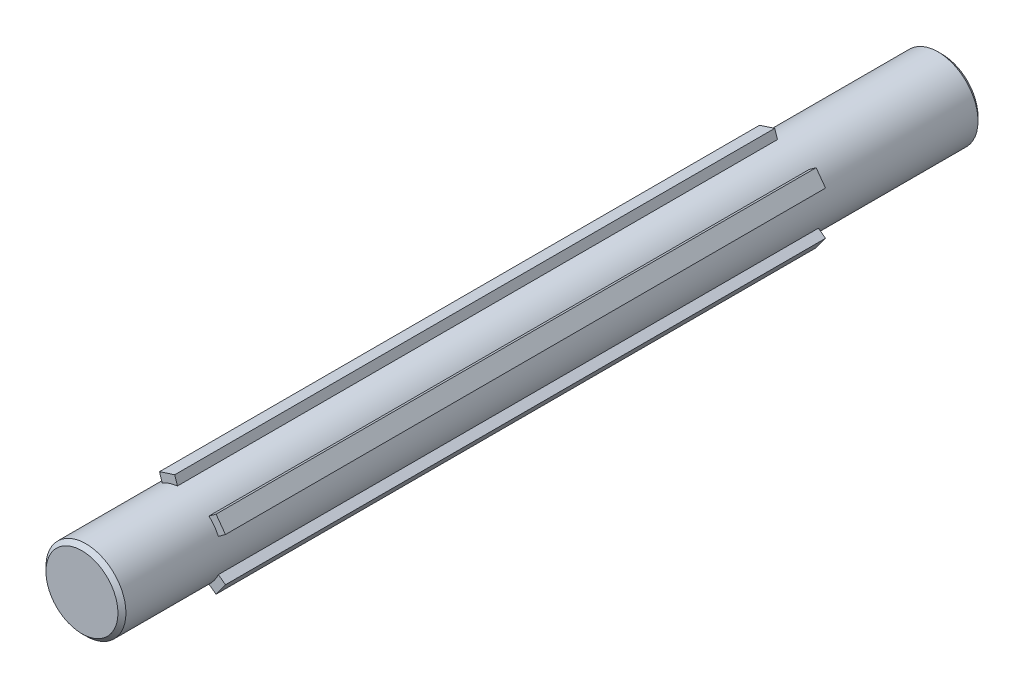
ISO-10303-21;
HEADER;
FILE_DESCRIPTION(('STEP AP214'),'2;1');
FILE_NAME('part.step','',(''),(''),'','','');
FILE_SCHEMA(('AUTOMOTIVE_DESIGN { 1 0 10303 214 1 1 1 1 }'));
ENDSEC;
DATA;
#1=APPLICATION_CONTEXT('core data for automotive mechanical design processes');
#2=APPLICATION_PROTOCOL_DEFINITION('international standard','automotive_design',2000,#1);
#3=PRODUCT_CONTEXT('',#1,'mechanical');
#4=PRODUCT('Part','Part','',(#3));
#5=PRODUCT_RELATED_PRODUCT_CATEGORY('part','',(#4));
#6=PRODUCT_DEFINITION_FORMATION('','',#4);
#7=PRODUCT_DEFINITION_CONTEXT('part definition',#1,'design');
#8=PRODUCT_DEFINITION('design','',#6,#7);
#9=PRODUCT_DEFINITION_SHAPE('','',#8);
#10=(LENGTH_UNIT() NAMED_UNIT(*) SI_UNIT(.MILLI.,.METRE.));
#11=(NAMED_UNIT(*) PLANE_ANGLE_UNIT() SI_UNIT($,.RADIAN.));
#12=(NAMED_UNIT(*) SI_UNIT($,.STERADIAN.) SOLID_ANGLE_UNIT());
#13=UNCERTAINTY_MEASURE_WITH_UNIT(LENGTH_MEASURE(1.E-05),#10,'distance_accuracy_value','');
#14=(GEOMETRIC_REPRESENTATION_CONTEXT(3) GLOBAL_UNCERTAINTY_ASSIGNED_CONTEXT((#13)) GLOBAL_UNIT_ASSIGNED_CONTEXT((#10,
#11,#12)) REPRESENTATION_CONTEXT('',''));
#15=CARTESIAN_POINT('',(0.,0.,0.));
#16=DIRECTION('',(0.,0.,1.));
#17=DIRECTION('',(1.,0.,0.));
#18=AXIS2_PLACEMENT_3D('',#15,#16,#17);
#19=CARTESIAN_POINT('',(0.,0.,215.));
#20=DIRECTION('',(0.,0.,-1.));
#21=DIRECTION('',(-1.,0.,0.));
#22=AXIS2_PLACEMENT_3D('',#19,#20,#21);
#23=CYLINDRICAL_SURFACE('',#22,10.);
#24=CARTESIAN_POINT('',(0.,0.,214.));
#25=DIRECTION('',(0.,0.,1.));
#26=DIRECTION('',(1.,0.,0.));
#27=AXIS2_PLACEMENT_3D('',#24,#25,#26);
#28=CIRCLE('',#27,10.);
#29=CARTESIAN_POINT('',(10.,0.,214.));
#30=VERTEX_POINT('',#29);
#31=EDGE_CURVE('E44',#30,#30,#28,.F.);
#32=ORIENTED_EDGE('',*,*,#31,.T.);
#33=EDGE_LOOP('',(#32));
#34=FACE_BOUND('',#33,.T.);
#35=CARTESIAN_POINT('',(0.,0.,1.));
#36=DIRECTION('',(0.,0.,1.));
#37=DIRECTION('',(1.,0.,0.));
#38=AXIS2_PLACEMENT_3D('',#35,#36,#37);
#39=CIRCLE('',#38,10.);
#40=CARTESIAN_POINT('',(10.,0.,1.));
#41=VERTEX_POINT('',#40);
#42=EDGE_CURVE('E335',#41,#41,#39,.T.);
#43=ORIENTED_EDGE('',*,*,#42,.T.);
#44=EDGE_LOOP('',(#43));
#45=FACE_BOUND('',#44,.T.);
#46=DIRECTION('',(0.,0.,-1.));
#47=VECTOR('',#46,1.);
#48=CARTESIAN_POINT('',(-4.92984886485879,-8.70037873713843,190.));
#49=LINE('',#48,#47);
#50=CARTESIAN_POINT('',(-4.92984886485879,-8.70037873713843,190.));
#51=VERTEX_POINT('',#50);
#52=CARTESIAN_POINT('',(-4.92984886485879,-8.70037873713843,40.));
#53=VERTEX_POINT('',#52);
#54=EDGE_CURVE('E51',#51,#53,#49,.T.);
#55=ORIENTED_EDGE('',*,*,#54,.F.);
#56=CARTESIAN_POINT('',(0.,0.,190.));
#57=DIRECTION('',(0.,0.,1.));
#58=DIRECTION('',(1.,0.,0.));
#59=AXIS2_PLACEMENT_3D('',#56,#57,#58);
#60=CIRCLE('',#59,10.);
#61=CARTESIAN_POINT('',(-1.12562279967817,-9.93644671463822,190.));
#62=VERTEX_POINT('',#61);
#63=EDGE_CURVE('E55',#51,#62,#60,.T.);
#64=ORIENTED_EDGE('',*,*,#63,.T.);
#65=DIRECTION('',(0.,0.,-1.));
#66=VECTOR('',#65,1.);
#67=CARTESIAN_POINT('',(-1.12562279967817,-9.93644671463822,190.));
#68=LINE('',#67,#66);
#69=CARTESIAN_POINT('',(-1.12562279967817,-9.93644671463822,40.));
#70=VERTEX_POINT('',#69);
#71=EDGE_CURVE('E196',#62,#70,#68,.T.);
#72=ORIENTED_EDGE('',*,*,#71,.T.);
#73=CARTESIAN_POINT('',(0.,0.,40.));
#74=DIRECTION('',(0.,0.,1.));
#75=DIRECTION('',(1.,0.,0.));
#76=AXIS2_PLACEMENT_3D('',#73,#74,#75);
#77=CIRCLE('',#76,10.);
#78=EDGE_CURVE('E197',#53,#70,#77,.T.);
#79=ORIENTED_EDGE('',*,*,#78,.F.);
#80=EDGE_LOOP('',(#55,#64,#72,#79));
#81=FACE_BOUND('',#80,.T.);
#82=DIRECTION('',(0.,0.,-1.));
#83=VECTOR('',#82,1.);
#84=CARTESIAN_POINT('',(-9.79795897113271,2.,190.));
#85=LINE('',#84,#83);
#86=CARTESIAN_POINT('',(-9.79795897113271,2.,190.));
#87=VERTEX_POINT('',#86);
#88=CARTESIAN_POINT('',(-9.79795897113271,2.,40.));
#89=VERTEX_POINT('',#88);
#90=EDGE_CURVE('E236',#87,#89,#85,.T.);
#91=ORIENTED_EDGE('',*,*,#90,.F.);
#92=CARTESIAN_POINT('',(0.,0.,190.));
#93=DIRECTION('',(0.,0.,1.));
#94=DIRECTION('',(1.,0.,0.));
#95=AXIS2_PLACEMENT_3D('',#92,#93,#94);
#96=CIRCLE('',#95,10.);
#97=CARTESIAN_POINT('',(-9.79795897113271,-2.,190.));
#98=VERTEX_POINT('',#97);
#99=EDGE_CURVE('E209',#87,#98,#96,.T.);
#100=ORIENTED_EDGE('',*,*,#99,.T.);
#101=DIRECTION('',(0.,0.,-1.));
#102=VECTOR('',#101,1.);
#103=CARTESIAN_POINT('',(-9.79795897113271,-2.,190.));
#104=LINE('',#103,#102);
#105=CARTESIAN_POINT('',(-9.79795897113271,-2.,40.));
#106=VERTEX_POINT('',#105);
#107=EDGE_CURVE('E220',#98,#106,#104,.T.);
#108=ORIENTED_EDGE('',*,*,#107,.T.);
#109=CARTESIAN_POINT('',(0.,0.,40.));
#110=DIRECTION('',(0.,0.,1.));
#111=DIRECTION('',(1.,0.,0.));
#112=AXIS2_PLACEMENT_3D('',#109,#110,#111);
#113=CIRCLE('',#112,10.);
#114=EDGE_CURVE('E208',#89,#106,#113,.T.);
#115=ORIENTED_EDGE('',*,*,#114,.F.);
#116=EDGE_LOOP('',(#91,#100,#108,#115));
#117=FACE_BOUND('',#116,.T.);
#118=DIRECTION('',(0.,0.,-1.));
#119=VECTOR('',#118,1.);
#120=CARTESIAN_POINT('',(-1.12562279967818,9.93644671463822,190.));
#121=LINE('',#120,#119);
#122=CARTESIAN_POINT('',(-1.12562279967818,9.93644671463822,190.));
#123=VERTEX_POINT('',#122);
#124=CARTESIAN_POINT('',(-1.12562279967818,9.93644671463822,40.));
#125=VERTEX_POINT('',#124);
#126=EDGE_CURVE('E267',#123,#125,#121,.T.);
#127=ORIENTED_EDGE('',*,*,#126,.F.);
#128=CARTESIAN_POINT('',(0.,0.,190.));
#129=DIRECTION('',(0.,0.,1.));
#130=DIRECTION('',(1.,0.,0.));
#131=AXIS2_PLACEMENT_3D('',#128,#129,#130);
#132=CIRCLE('',#131,10.);
#133=CARTESIAN_POINT('',(-4.92984886485879,8.70037873713843,190.));
#134=VERTEX_POINT('',#133);
#135=EDGE_CURVE('E240',#123,#134,#132,.T.);
#136=ORIENTED_EDGE('',*,*,#135,.T.);
#137=DIRECTION('',(0.,0.,-1.));
#138=VECTOR('',#137,1.);
#139=CARTESIAN_POINT('',(-4.92984886485879,8.70037873713843,190.));
#140=LINE('',#139,#138);
#141=CARTESIAN_POINT('',(-4.92984886485879,8.70037873713843,40.));
#142=VERTEX_POINT('',#141);
#143=EDGE_CURVE('E251',#134,#142,#140,.T.);
#144=ORIENTED_EDGE('',*,*,#143,.T.);
#145=CARTESIAN_POINT('',(0.,0.,40.));
#146=DIRECTION('',(0.,0.,1.));
#147=DIRECTION('',(1.,0.,0.));
#148=AXIS2_PLACEMENT_3D('',#145,#146,#147);
#149=CIRCLE('',#148,10.);
#150=EDGE_CURVE('E239',#125,#142,#149,.T.);
#151=ORIENTED_EDGE('',*,*,#150,.F.);
#152=EDGE_LOOP('',(#127,#136,#144,#151));
#153=FACE_BOUND('',#152,.T.);
#154=DIRECTION('',(0.,0.,-1.));
#155=VECTOR('',#154,1.);
#156=CARTESIAN_POINT('',(6.75114481324989,-7.37712977454844,190.));
#157=LINE('',#156,#155);
#158=CARTESIAN_POINT('',(6.75114481324989,-7.37712977454844,190.));
#159=VERTEX_POINT('',#158);
#160=CARTESIAN_POINT('',(6.75114481324989,-7.37712977454844,40.));
#161=VERTEX_POINT('',#160);
#162=EDGE_CURVE('E298',#159,#161,#157,.T.);
#163=ORIENTED_EDGE('',*,*,#162,.F.);
#164=CARTESIAN_POINT('',(0.,0.,190.));
#165=DIRECTION('',(0.,0.,1.));
#166=DIRECTION('',(1.,0.,0.));
#167=AXIS2_PLACEMENT_3D('',#164,#165,#166);
#168=CIRCLE('',#167,10.);
#169=CARTESIAN_POINT('',(9.10228582241979,-4.14106179704865,190.));
#170=VERTEX_POINT('',#169);
#171=EDGE_CURVE('E271',#159,#170,#168,.T.);
#172=ORIENTED_EDGE('',*,*,#171,.T.);
#173=DIRECTION('',(0.,0.,-1.));
#174=VECTOR('',#173,1.);
#175=CARTESIAN_POINT('',(9.10228582241979,-4.14106179704865,190.));
#176=LINE('',#175,#174);
#177=CARTESIAN_POINT('',(9.10228582241979,-4.14106179704865,40.));
#178=VERTEX_POINT('',#177);
#179=EDGE_CURVE('E282',#170,#178,#176,.T.);
#180=ORIENTED_EDGE('',*,*,#179,.T.);
#181=CARTESIAN_POINT('',(0.,0.,40.));
#182=DIRECTION('',(0.,0.,1.));
#183=DIRECTION('',(1.,0.,0.));
#184=AXIS2_PLACEMENT_3D('',#181,#182,#183);
#185=CIRCLE('',#184,10.);
#186=EDGE_CURVE('E270',#161,#178,#185,.T.);
#187=ORIENTED_EDGE('',*,*,#186,.F.);
#188=EDGE_LOOP('',(#163,#172,#180,#187));
#189=FACE_BOUND('',#188,.T.);
#190=DIRECTION('',(0.,0.,-1.));
#191=VECTOR('',#190,1.);
#192=CARTESIAN_POINT('',(9.10228582241979,4.14106179704865,190.));
#193=LINE('',#192,#191);
#194=CARTESIAN_POINT('',(9.10228582241979,4.14106179704865,190.));
#195=VERTEX_POINT('',#194);
#196=CARTESIAN_POINT('',(9.10228582241979,4.14106179704865,40.));
#197=VERTEX_POINT('',#196);
#198=EDGE_CURVE('E329',#195,#197,#193,.T.);
#199=ORIENTED_EDGE('',*,*,#198,.F.);
#200=CARTESIAN_POINT('',(0.,0.,190.));
#201=DIRECTION('',(0.,0.,1.));
#202=DIRECTION('',(1.,0.,0.));
#203=AXIS2_PLACEMENT_3D('',#200,#201,#202);
#204=CIRCLE('',#203,10.);
#205=CARTESIAN_POINT('',(6.75114481324989,7.37712977454844,190.));
#206=VERTEX_POINT('',#205);
#207=EDGE_CURVE('E302',#195,#206,#204,.T.);
#208=ORIENTED_EDGE('',*,*,#207,.T.);
#209=DIRECTION('',(0.,0.,-1.));
#210=VECTOR('',#209,1.);
#211=CARTESIAN_POINT('',(6.75114481324989,7.37712977454844,190.));
#212=LINE('',#211,#210);
#213=CARTESIAN_POINT('',(6.75114481324989,7.37712977454844,40.));
#214=VERTEX_POINT('',#213);
#215=EDGE_CURVE('E313',#206,#214,#212,.T.);
#216=ORIENTED_EDGE('',*,*,#215,.T.);
#217=CARTESIAN_POINT('',(0.,0.,40.));
#218=DIRECTION('',(0.,0.,1.));
#219=DIRECTION('',(1.,0.,0.));
#220=AXIS2_PLACEMENT_3D('',#217,#218,#219);
#221=CIRCLE('',#220,10.);
#222=EDGE_CURVE('E301',#197,#214,#221,.T.);
#223=ORIENTED_EDGE('',*,*,#222,.F.);
#224=EDGE_LOOP('',(#199,#208,#216,#223));
#225=FACE_BOUND('',#224,.T.);
#226=ADVANCED_FACE('F35',(#34,#45,#81,#117,#153,#189,#225),#23,.T.);
#227=CARTESIAN_POINT('',(0.,0.,215.));
#228=DIRECTION('',(0.,0.,1.));
#229=DIRECTION('',(1.,0.,0.));
#230=AXIS2_PLACEMENT_3D('',#227,#228,#229);
#231=PLANE('',#230);
#232=CARTESIAN_POINT('',(0.,0.,215.));
#233=DIRECTION('',(0.,0.,1.));
#234=DIRECTION('',(1.,0.,0.));
#235=AXIS2_PLACEMENT_3D('',#232,#233,#234);
#236=CIRCLE('',#235,9.00000000000004);
#237=CARTESIAN_POINT('',(9.00000000000004,0.,215.));
#238=VERTEX_POINT('',#237);
#239=EDGE_CURVE('E332',#238,#238,#236,.T.);
#240=ORIENTED_EDGE('',*,*,#239,.T.);
#241=EDGE_LOOP('',(#240));
#242=FACE_BOUND('',#241,.T.);
#243=ADVANCED_FACE('F348',(#242),#231,.T.);
#244=CARTESIAN_POINT('',(0.,0.,0.));
#245=DIRECTION('',(0.,0.,1.));
#246=DIRECTION('',(1.,0.,0.));
#247=AXIS2_PLACEMENT_3D('',#244,#245,#246);
#248=PLANE('',#247);
#249=CARTESIAN_POINT('',(0.,0.,0.));
#250=DIRECTION('',(0.,0.,1.));
#251=DIRECTION('',(1.,0.,0.));
#252=AXIS2_PLACEMENT_3D('',#249,#250,#251);
#253=CIRCLE('',#252,8.99999999999998);
#254=CARTESIAN_POINT('',(8.99999999999998,0.,0.));
#255=VERTEX_POINT('',#254);
#256=EDGE_CURVE('E11',#255,#255,#253,.F.);
#257=ORIENTED_EDGE('',*,*,#256,.T.);
#258=EDGE_LOOP('',(#257));
#259=FACE_BOUND('',#258,.T.);
#260=ADVANCED_FACE('F350',(#259),#248,.F.);
#261=CARTESIAN_POINT('',(1.17557050458495,-1.61803398874989,190.));
#262=DIRECTION('',(0.587785252292473,-0.809016994374947,0.));
#263=DIRECTION('',(0.809016994374947,0.587785252292473,0.));
#264=AXIS2_PLACEMENT_3D('',#261,#262,#263);
#265=PLANE('',#264);
#266=DIRECTION('',(-0.809016994374947,-0.587785252292473,0.));
#267=VECTOR('',#266,1.);
#268=CARTESIAN_POINT('',(1.17557050458495,-1.61803398874989,40.));
#269=LINE('',#268,#267);
#270=CARTESIAN_POINT('',(10.8837744370843,5.43538903875978,40.));
#271=VERTEX_POINT('',#270);
#272=EDGE_CURVE('E316',#271,#197,#269,.T.);
#273=ORIENTED_EDGE('',*,*,#272,.F.);
#274=DIRECTION('',(0.,0.,-1.));
#275=VECTOR('',#274,1.);
#276=CARTESIAN_POINT('',(10.8837744370843,5.43538903875978,190.));
#277=LINE('',#276,#275);
#278=CARTESIAN_POINT('',(10.8837744370843,5.43538903875978,190.));
#279=VERTEX_POINT('',#278);
#280=EDGE_CURVE('E327',#279,#271,#277,.T.);
#281=ORIENTED_EDGE('',*,*,#280,.F.);
#282=DIRECTION('',(-0.809016994374947,-0.587785252292473,0.));
#283=VECTOR('',#282,1.);
#284=CARTESIAN_POINT('',(1.17557050458495,-1.61803398874989,190.));
#285=LINE('',#284,#283);
#286=EDGE_CURVE('E304',#279,#195,#285,.T.);
#287=ORIENTED_EDGE('',*,*,#286,.T.);
#288=ORIENTED_EDGE('',*,*,#198,.T.);
#289=EDGE_LOOP('',(#273,#281,#287,#288));
#290=FACE_BOUND('',#289,.T.);
#291=ADVANCED_FACE('F356',(#290),#265,.T.);
#292=CARTESIAN_POINT('',(9.70820393249937,7.05342302750967,190.));
#293=DIRECTION('',(-0.809016994374948,-0.587785252292473,0.));
#294=DIRECTION('',(0.587785252292473,-0.809016994374948,0.));
#295=AXIS2_PLACEMENT_3D('',#292,#293,#294);
#296=PLANE('',#295);
#297=DIRECTION('',(-0.587785252292473,0.809016994374948,0.));
#298=VECTOR('',#297,1.);
#299=CARTESIAN_POINT('',(9.70820393249937,7.05342302750967,40.));
#300=LINE('',#299,#298);
#301=CARTESIAN_POINT('',(8.53263342791442,8.67145701625957,40.));
#302=VERTEX_POINT('',#301);
#303=EDGE_CURVE('E319',#271,#302,#300,.T.);
#304=ORIENTED_EDGE('',*,*,#303,.T.);
#305=DIRECTION('',(0.,0.,-1.));
#306=VECTOR('',#305,1.);
#307=CARTESIAN_POINT('',(8.53263342791442,8.67145701625957,190.));
#308=LINE('',#307,#306);
#309=CARTESIAN_POINT('',(8.53263342791442,8.67145701625957,190.));
#310=VERTEX_POINT('',#309);
#311=EDGE_CURVE('E324',#310,#302,#308,.T.);
#312=ORIENTED_EDGE('',*,*,#311,.F.);
#313=DIRECTION('',(-0.587785252292473,0.809016994374948,0.));
#314=VECTOR('',#313,1.);
#315=CARTESIAN_POINT('',(9.70820393249937,7.05342302750967,190.));
#316=LINE('',#315,#314);
#317=EDGE_CURVE('E308',#279,#310,#316,.T.);
#318=ORIENTED_EDGE('',*,*,#317,.F.);
#319=ORIENTED_EDGE('',*,*,#280,.T.);
#320=EDGE_LOOP('',(#304,#312,#318,#319));
#321=FACE_BOUND('',#320,.T.);
#322=ADVANCED_FACE('F368',(#321),#296,.F.);
#323=CARTESIAN_POINT('',(-1.17557050458494,1.61803398874989,190.));
#324=DIRECTION('',(0.587785252292474,-0.809016994374947,0.));
#325=DIRECTION('',(0.809016994374947,0.587785252292474,0.));
#326=AXIS2_PLACEMENT_3D('',#323,#324,#325);
#327=PLANE('',#326);
#328=DIRECTION('',(-0.809016994374947,-0.587785252292474,0.));
#329=VECTOR('',#328,1.);
#330=CARTESIAN_POINT('',(-1.17557050458494,1.61803398874989,40.));
#331=LINE('',#330,#329);
#332=EDGE_CURVE('E305',#302,#214,#331,.T.);
#333=ORIENTED_EDGE('',*,*,#332,.T.);
#334=ORIENTED_EDGE('',*,*,#215,.F.);
#335=DIRECTION('',(-0.809016994374947,-0.587785252292474,0.));
#336=VECTOR('',#335,1.);
#337=CARTESIAN_POINT('',(-1.17557050458494,1.61803398874989,190.));
#338=LINE('',#337,#336);
#339=EDGE_CURVE('E310',#310,#206,#338,.T.);
#340=ORIENTED_EDGE('',*,*,#339,.F.);
#341=ORIENTED_EDGE('',*,*,#311,.T.);
#342=EDGE_LOOP('',(#333,#334,#340,#341));
#343=FACE_BOUND('',#342,.T.);
#344=ADVANCED_FACE('F372',(#343),#327,.F.);
#345=CARTESIAN_POINT('',(0.,0.,190.));
#346=DIRECTION('',(0.,0.,1.));
#347=DIRECTION('',(1.,0.,0.));
#348=AXIS2_PLACEMENT_3D('',#345,#346,#347);
#349=PLANE('',#348);
#350=ORIENTED_EDGE('',*,*,#207,.F.);
#351=ORIENTED_EDGE('',*,*,#286,.F.);
#352=ORIENTED_EDGE('',*,*,#317,.T.);
#353=ORIENTED_EDGE('',*,*,#339,.T.);
#354=EDGE_LOOP('',(#350,#351,#352,#353));
#355=FACE_BOUND('',#354,.T.);
#356=ADVANCED_FACE('F376',(#355),#349,.T.);
#357=CARTESIAN_POINT('',(0.,0.,40.));
#358=DIRECTION('',(0.,0.,1.));
#359=DIRECTION('',(1.,0.,0.));
#360=AXIS2_PLACEMENT_3D('',#357,#358,#359);
#361=PLANE('',#360);
#362=ORIENTED_EDGE('',*,*,#222,.T.);
#363=ORIENTED_EDGE('',*,*,#332,.F.);
#364=ORIENTED_EDGE('',*,*,#303,.F.);
#365=ORIENTED_EDGE('',*,*,#272,.T.);
#366=EDGE_LOOP('',(#362,#363,#364,#365));
#367=FACE_BOUND('',#366,.T.);
#368=ADVANCED_FACE('F378',(#367),#361,.F.);
#369=CARTESIAN_POINT('',(-1.17557050458494,-1.61803398874989,190.));
#370=DIRECTION('',(-0.587785252292473,-0.809016994374947,0.));
#371=DIRECTION('',(0.809016994374947,-0.587785252292473,0.));
#372=AXIS2_PLACEMENT_3D('',#369,#370,#371);
#373=PLANE('',#372);
#374=DIRECTION('',(-0.809016994374947,0.587785252292473,0.));
#375=VECTOR('',#374,1.);
#376=CARTESIAN_POINT('',(-1.17557050458494,-1.61803398874989,40.));
#377=LINE('',#376,#375);
#378=CARTESIAN_POINT('',(8.53263342791443,-8.67145701625957,40.));
#379=VERTEX_POINT('',#378);
#380=EDGE_CURVE('E285',#379,#161,#377,.T.);
#381=ORIENTED_EDGE('',*,*,#380,.F.);
#382=DIRECTION('',(0.,0.,-1.));
#383=VECTOR('',#382,1.);
#384=CARTESIAN_POINT('',(8.53263342791443,-8.67145701625957,190.));
#385=LINE('',#384,#383);
#386=CARTESIAN_POINT('',(8.53263342791443,-8.67145701625957,190.));
#387=VERTEX_POINT('',#386);
#388=EDGE_CURVE('E296',#387,#379,#385,.T.);
#389=ORIENTED_EDGE('',*,*,#388,.F.);
#390=DIRECTION('',(-0.809016994374947,0.587785252292473,0.));
#391=VECTOR('',#390,1.);
#392=CARTESIAN_POINT('',(-1.17557050458494,-1.61803398874989,190.));
#393=LINE('',#392,#391);
#394=EDGE_CURVE('E273',#387,#159,#393,.T.);
#395=ORIENTED_EDGE('',*,*,#394,.T.);
#396=ORIENTED_EDGE('',*,*,#162,.T.);
#397=EDGE_LOOP('',(#381,#389,#395,#396));
#398=FACE_BOUND('',#397,.T.);
#399=ADVANCED_FACE('F381',(#398),#373,.T.);
#400=CARTESIAN_POINT('',(9.70820393249937,-7.05342302750968,190.));
#401=DIRECTION('',(-0.809016994374948,0.587785252292473,0.));
#402=DIRECTION('',(-0.587785252292473,-0.809016994374948,0.));
#403=AXIS2_PLACEMENT_3D('',#400,#401,#402);
#404=PLANE('',#403);
#405=DIRECTION('',(0.587785252292473,0.809016994374948,0.));
#406=VECTOR('',#405,1.);
#407=CARTESIAN_POINT('',(9.70820393249937,-7.05342302750968,40.));
#408=LINE('',#407,#406);
#409=CARTESIAN_POINT('',(10.8837744370843,-5.43538903875979,40.));
#410=VERTEX_POINT('',#409);
#411=EDGE_CURVE('E288',#379,#410,#408,.T.);
#412=ORIENTED_EDGE('',*,*,#411,.T.);
#413=DIRECTION('',(0.,0.,-1.));
#414=VECTOR('',#413,1.);
#415=CARTESIAN_POINT('',(10.8837744370843,-5.43538903875979,190.));
#416=LINE('',#415,#414);
#417=CARTESIAN_POINT('',(10.8837744370843,-5.43538903875979,190.));
#418=VERTEX_POINT('',#417);
#419=EDGE_CURVE('E293',#418,#410,#416,.T.);
#420=ORIENTED_EDGE('',*,*,#419,.F.);
#421=DIRECTION('',(0.587785252292473,0.809016994374948,0.));
#422=VECTOR('',#421,1.);
#423=CARTESIAN_POINT('',(9.70820393249937,-7.05342302750968,190.));
#424=LINE('',#423,#422);
#425=EDGE_CURVE('E277',#387,#418,#424,.T.);
#426=ORIENTED_EDGE('',*,*,#425,.F.);
#427=ORIENTED_EDGE('',*,*,#388,.T.);
#428=EDGE_LOOP('',(#412,#420,#426,#427));
#429=FACE_BOUND('',#428,.T.);
#430=ADVANCED_FACE('F388',(#429),#404,.F.);
#431=CARTESIAN_POINT('',(1.17557050458494,1.61803398874989,190.));
#432=DIRECTION('',(-0.587785252292473,-0.809016994374948,0.));
#433=DIRECTION('',(0.809016994374948,-0.587785252292473,0.));
#434=AXIS2_PLACEMENT_3D('',#431,#432,#433);
#435=PLANE('',#434);
#436=DIRECTION('',(-0.809016994374947,0.587785252292473,0.));
#437=VECTOR('',#436,1.);
#438=CARTESIAN_POINT('',(1.17557050458494,1.61803398874989,40.));
#439=LINE('',#438,#437);
#440=EDGE_CURVE('E274',#410,#178,#439,.T.);
#441=ORIENTED_EDGE('',*,*,#440,.T.);
#442=ORIENTED_EDGE('',*,*,#179,.F.);
#443=DIRECTION('',(-0.809016994374947,0.587785252292473,0.));
#444=VECTOR('',#443,1.);
#445=CARTESIAN_POINT('',(1.17557050458494,1.61803398874989,190.));
#446=LINE('',#445,#444);
#447=EDGE_CURVE('E279',#418,#170,#446,.T.);
#448=ORIENTED_EDGE('',*,*,#447,.F.);
#449=ORIENTED_EDGE('',*,*,#419,.T.);
#450=EDGE_LOOP('',(#441,#442,#448,#449));
#451=FACE_BOUND('',#450,.T.);
#452=ADVANCED_FACE('F392',(#451),#435,.F.);
#453=CARTESIAN_POINT('',(0.,0.,190.));
#454=DIRECTION('',(0.,0.,1.));
#455=DIRECTION('',(1.,0.,0.));
#456=AXIS2_PLACEMENT_3D('',#453,#454,#455);
#457=PLANE('',#456);
#458=ORIENTED_EDGE('',*,*,#171,.F.);
#459=ORIENTED_EDGE('',*,*,#394,.F.);
#460=ORIENTED_EDGE('',*,*,#425,.T.);
#461=ORIENTED_EDGE('',*,*,#447,.T.);
#462=EDGE_LOOP('',(#458,#459,#460,#461));
#463=FACE_BOUND('',#462,.T.);
#464=ADVANCED_FACE('F396',(#463),#457,.T.);
#465=CARTESIAN_POINT('',(0.,0.,40.));
#466=DIRECTION('',(0.,0.,1.));
#467=DIRECTION('',(1.,0.,0.));
#468=AXIS2_PLACEMENT_3D('',#465,#466,#467);
#469=PLANE('',#468);
#470=ORIENTED_EDGE('',*,*,#186,.T.);
#471=ORIENTED_EDGE('',*,*,#440,.F.);
#472=ORIENTED_EDGE('',*,*,#411,.F.);
#473=ORIENTED_EDGE('',*,*,#380,.T.);
#474=EDGE_LOOP('',(#470,#471,#472,#473));
#475=FACE_BOUND('',#474,.T.);
#476=ADVANCED_FACE('F398',(#475),#469,.F.);
#477=CARTESIAN_POINT('',(1.90211303259031,0.618033988749896,190.));
#478=DIRECTION('',(0.951056516295153,0.309016994374948,0.));
#479=DIRECTION('',(-0.309016994374948,0.951056516295154,0.));
#480=AXIS2_PLACEMENT_3D('',#477,#478,#479);
#481=PLANE('',#480);
#482=DIRECTION('',(0.309016994374948,-0.951056516295154,0.));
#483=VECTOR('',#482,1.);
#484=CARTESIAN_POINT('',(1.90211303259031,0.618033988749896,40.));
#485=LINE('',#484,#483);
#486=CARTESIAN_POINT('',(-1.80609089990906,12.0307121842917,40.));
#487=VERTEX_POINT('',#486);
#488=EDGE_CURVE('E254',#487,#125,#485,.T.);
#489=ORIENTED_EDGE('',*,*,#488,.F.);
#490=DIRECTION('',(0.,0.,-1.));
#491=VECTOR('',#490,1.);
#492=CARTESIAN_POINT('',(-1.80609089990906,12.0307121842917,190.));
#493=LINE('',#492,#491);
#494=CARTESIAN_POINT('',(-1.80609089990906,12.0307121842917,190.));
#495=VERTEX_POINT('',#494);
#496=EDGE_CURVE('E265',#495,#487,#493,.T.);
#497=ORIENTED_EDGE('',*,*,#496,.F.);
#498=DIRECTION('',(0.309016994374948,-0.951056516295154,0.));
#499=VECTOR('',#498,1.);
#500=CARTESIAN_POINT('',(1.90211303259031,0.618033988749896,190.));
#501=LINE('',#500,#499);
#502=EDGE_CURVE('E242',#495,#123,#501,.T.);
#503=ORIENTED_EDGE('',*,*,#502,.T.);
#504=ORIENTED_EDGE('',*,*,#126,.T.);
#505=EDGE_LOOP('',(#489,#497,#503,#504));
#506=FACE_BOUND('',#505,.T.);
#507=ADVANCED_FACE('F401',(#506),#481,.T.);
#508=CARTESIAN_POINT('',(-3.70820393249937,11.4126781955418,190.));
#509=DIRECTION('',(0.309016994374947,-0.951056516295154,0.));
#510=DIRECTION('',(0.951056516295154,0.309016994374947,0.));
#511=AXIS2_PLACEMENT_3D('',#508,#509,#510);
#512=PLANE('',#511);
#513=DIRECTION('',(-0.951056516295154,-0.309016994374947,0.));
#514=VECTOR('',#513,1.);
#515=CARTESIAN_POINT('',(-3.70820393249937,11.4126781955418,40.));
#516=LINE('',#515,#514);
#517=CARTESIAN_POINT('',(-5.61031696508968,10.7946442067919,40.));
#518=VERTEX_POINT('',#517);
#519=EDGE_CURVE('E257',#487,#518,#516,.T.);
#520=ORIENTED_EDGE('',*,*,#519,.T.);
#521=DIRECTION('',(0.,0.,-1.));
#522=VECTOR('',#521,1.);
#523=CARTESIAN_POINT('',(-5.61031696508968,10.7946442067919,190.));
#524=LINE('',#523,#522);
#525=CARTESIAN_POINT('',(-5.61031696508968,10.7946442067919,190.));
#526=VERTEX_POINT('',#525);
#527=EDGE_CURVE('E262',#526,#518,#524,.T.);
#528=ORIENTED_EDGE('',*,*,#527,.F.);
#529=DIRECTION('',(-0.951056516295154,-0.309016994374947,0.));
#530=VECTOR('',#529,1.);
#531=CARTESIAN_POINT('',(-3.70820393249937,11.4126781955418,190.));
#532=LINE('',#531,#530);
#533=EDGE_CURVE('E246',#495,#526,#532,.T.);
#534=ORIENTED_EDGE('',*,*,#533,.F.);
#535=ORIENTED_EDGE('',*,*,#496,.T.);
#536=EDGE_LOOP('',(#520,#528,#534,#535));
#537=FACE_BOUND('',#536,.T.);
#538=ADVANCED_FACE('F408',(#537),#512,.F.);
#539=CARTESIAN_POINT('',(-1.90211303259031,-0.618033988749895,190.));
#540=DIRECTION('',(0.951056516295153,0.309016994374948,0.));
#541=DIRECTION('',(-0.309016994374948,0.951056516295154,0.));
#542=AXIS2_PLACEMENT_3D('',#539,#540,#541);
#543=PLANE('',#542);
#544=DIRECTION('',(0.309016994374948,-0.951056516295154,0.));
#545=VECTOR('',#544,1.);
#546=CARTESIAN_POINT('',(-1.90211303259031,-0.618033988749895,40.));
#547=LINE('',#546,#545);
#548=EDGE_CURVE('E243',#518,#142,#547,.T.);
#549=ORIENTED_EDGE('',*,*,#548,.T.);
#550=ORIENTED_EDGE('',*,*,#143,.F.);
#551=DIRECTION('',(0.309016994374948,-0.951056516295154,0.));
#552=VECTOR('',#551,1.);
#553=CARTESIAN_POINT('',(-1.90211303259031,-0.618033988749895,190.));
#554=LINE('',#553,#552);
#555=EDGE_CURVE('E248',#526,#134,#554,.T.);
#556=ORIENTED_EDGE('',*,*,#555,.F.);
#557=ORIENTED_EDGE('',*,*,#527,.T.);
#558=EDGE_LOOP('',(#549,#550,#556,#557));
#559=FACE_BOUND('',#558,.T.);
#560=ADVANCED_FACE('F412',(#559),#543,.F.);
#561=CARTESIAN_POINT('',(0.,0.,190.));
#562=DIRECTION('',(0.,0.,1.));
#563=DIRECTION('',(1.,0.,0.));
#564=AXIS2_PLACEMENT_3D('',#561,#562,#563);
#565=PLANE('',#564);
#566=ORIENTED_EDGE('',*,*,#135,.F.);
#567=ORIENTED_EDGE('',*,*,#502,.F.);
#568=ORIENTED_EDGE('',*,*,#533,.T.);
#569=ORIENTED_EDGE('',*,*,#555,.T.);
#570=EDGE_LOOP('',(#566,#567,#568,#569));
#571=FACE_BOUND('',#570,.T.);
#572=ADVANCED_FACE('F416',(#571),#565,.T.);
#573=CARTESIAN_POINT('',(0.,0.,40.));
#574=DIRECTION('',(0.,0.,1.));
#575=DIRECTION('',(1.,0.,0.));
#576=AXIS2_PLACEMENT_3D('',#573,#574,#575);
#577=PLANE('',#576);
#578=ORIENTED_EDGE('',*,*,#150,.T.);
#579=ORIENTED_EDGE('',*,*,#548,.F.);
#580=ORIENTED_EDGE('',*,*,#519,.F.);
#581=ORIENTED_EDGE('',*,*,#488,.T.);
#582=EDGE_LOOP('',(#578,#579,#580,#581));
#583=FACE_BOUND('',#582,.T.);
#584=ADVANCED_FACE('F418',(#583),#577,.F.);
#585=CARTESIAN_POINT('',(0.,2.,190.));
#586=DIRECTION('',(0.,1.,0.));
#587=DIRECTION('',(0.,0.,1.));
#588=AXIS2_PLACEMENT_3D('',#585,#586,#587);
#589=PLANE('',#588);
#590=DIRECTION('',(1.,0.,0.));
#591=VECTOR('',#590,1.);
#592=CARTESIAN_POINT('',(0.,2.,40.));
#593=LINE('',#592,#591);
#594=CARTESIAN_POINT('',(-12.,2.,40.));
#595=VERTEX_POINT('',#594);
#596=EDGE_CURVE('E223',#595,#89,#593,.T.);
#597=ORIENTED_EDGE('',*,*,#596,.F.);
#598=DIRECTION('',(0.,0.,-1.));
#599=VECTOR('',#598,1.);
#600=CARTESIAN_POINT('',(-12.,2.,190.));
#601=LINE('',#600,#599);
#602=CARTESIAN_POINT('',(-12.,2.,190.));
#603=VERTEX_POINT('',#602);
#604=EDGE_CURVE('E234',#603,#595,#601,.T.);
#605=ORIENTED_EDGE('',*,*,#604,.F.);
#606=DIRECTION('',(1.,0.,0.));
#607=VECTOR('',#606,1.);
#608=CARTESIAN_POINT('',(0.,2.,190.));
#609=LINE('',#608,#607);
#610=EDGE_CURVE('E211',#603,#87,#609,.T.);
#611=ORIENTED_EDGE('',*,*,#610,.T.);
#612=ORIENTED_EDGE('',*,*,#90,.T.);
#613=EDGE_LOOP('',(#597,#605,#611,#612));
#614=FACE_BOUND('',#613,.T.);
#615=ADVANCED_FACE('F421',(#614),#589,.T.);
#616=CARTESIAN_POINT('',(-12.,0.,190.));
#617=DIRECTION('',(1.,0.,0.));
#618=DIRECTION('',(0.,0.,-1.));
#619=AXIS2_PLACEMENT_3D('',#616,#617,#618);
#620=PLANE('',#619);
#621=DIRECTION('',(0.,-1.,0.));
#622=VECTOR('',#621,1.);
#623=CARTESIAN_POINT('',(-12.,0.,40.));
#624=LINE('',#623,#622);
#625=CARTESIAN_POINT('',(-12.,-2.,40.));
#626=VERTEX_POINT('',#625);
#627=EDGE_CURVE('E226',#595,#626,#624,.T.);
#628=ORIENTED_EDGE('',*,*,#627,.T.);
#629=DIRECTION('',(0.,0.,-1.));
#630=VECTOR('',#629,1.);
#631=CARTESIAN_POINT('',(-12.,-2.,190.));
#632=LINE('',#631,#630);
#633=CARTESIAN_POINT('',(-12.,-2.,190.));
#634=VERTEX_POINT('',#633);
#635=EDGE_CURVE('E231',#634,#626,#632,.T.);
#636=ORIENTED_EDGE('',*,*,#635,.F.);
#637=DIRECTION('',(0.,-1.,0.));
#638=VECTOR('',#637,1.);
#639=CARTESIAN_POINT('',(-12.,0.,190.));
#640=LINE('',#639,#638);
#641=EDGE_CURVE('E215',#603,#634,#640,.T.);
#642=ORIENTED_EDGE('',*,*,#641,.F.);
#643=ORIENTED_EDGE('',*,*,#604,.T.);
#644=EDGE_LOOP('',(#628,#636,#642,#643));
#645=FACE_BOUND('',#644,.T.);
#646=ADVANCED_FACE('F428',(#645),#620,.F.);
#647=CARTESIAN_POINT('',(0.,-2.,190.));
#648=DIRECTION('',(0.,1.,0.));
#649=DIRECTION('',(0.,0.,1.));
#650=AXIS2_PLACEMENT_3D('',#647,#648,#649);
#651=PLANE('',#650);
#652=DIRECTION('',(1.,0.,0.));
#653=VECTOR('',#652,1.);
#654=CARTESIAN_POINT('',(0.,-2.,40.));
#655=LINE('',#654,#653);
#656=EDGE_CURVE('E212',#626,#106,#655,.T.);
#657=ORIENTED_EDGE('',*,*,#656,.T.);
#658=ORIENTED_EDGE('',*,*,#107,.F.);
#659=DIRECTION('',(1.,0.,0.));
#660=VECTOR('',#659,1.);
#661=CARTESIAN_POINT('',(0.,-2.,190.));
#662=LINE('',#661,#660);
#663=EDGE_CURVE('E217',#634,#98,#662,.T.);
#664=ORIENTED_EDGE('',*,*,#663,.F.);
#665=ORIENTED_EDGE('',*,*,#635,.T.);
#666=EDGE_LOOP('',(#657,#658,#664,#665));
#667=FACE_BOUND('',#666,.T.);
#668=ADVANCED_FACE('F432',(#667),#651,.F.);
#669=CARTESIAN_POINT('',(0.,0.,190.));
#670=DIRECTION('',(0.,0.,1.));
#671=DIRECTION('',(1.,0.,0.));
#672=AXIS2_PLACEMENT_3D('',#669,#670,#671);
#673=PLANE('',#672);
#674=ORIENTED_EDGE('',*,*,#99,.F.);
#675=ORIENTED_EDGE('',*,*,#610,.F.);
#676=ORIENTED_EDGE('',*,*,#641,.T.);
#677=ORIENTED_EDGE('',*,*,#663,.T.);
#678=EDGE_LOOP('',(#674,#675,#676,#677));
#679=FACE_BOUND('',#678,.T.);
#680=ADVANCED_FACE('F436',(#679),#673,.T.);
#681=CARTESIAN_POINT('',(0.,0.,40.));
#682=DIRECTION('',(0.,0.,1.));
#683=DIRECTION('',(1.,0.,0.));
#684=AXIS2_PLACEMENT_3D('',#681,#682,#683);
#685=PLANE('',#684);
#686=ORIENTED_EDGE('',*,*,#114,.T.);
#687=ORIENTED_EDGE('',*,*,#656,.F.);
#688=ORIENTED_EDGE('',*,*,#627,.F.);
#689=ORIENTED_EDGE('',*,*,#596,.T.);
#690=EDGE_LOOP('',(#686,#687,#688,#689));
#691=FACE_BOUND('',#690,.T.);
#692=ADVANCED_FACE('F438',(#691),#685,.F.);
#693=CARTESIAN_POINT('',(-1.90211303259031,0.618033988749894,190.));
#694=DIRECTION('',(-0.951056516295154,0.309016994374947,0.));
#695=DIRECTION('',(-0.309016994374947,-0.951056516295154,0.));
#696=AXIS2_PLACEMENT_3D('',#693,#694,#695);
#697=PLANE('',#696);
#698=DIRECTION('',(0.309016994374947,0.951056516295154,0.));
#699=VECTOR('',#698,1.);
#700=CARTESIAN_POINT('',(-1.90211303259031,0.618033988749894,40.));
#701=LINE('',#700,#699);
#702=CARTESIAN_POINT('',(-5.61031696508967,-10.7946442067919,40.));
#703=VERTEX_POINT('',#702);
#704=EDGE_CURVE('E177',#703,#53,#701,.T.);
#705=ORIENTED_EDGE('',*,*,#704,.F.);
#706=DIRECTION('',(0.,0.,-1.));
#707=VECTOR('',#706,1.);
#708=CARTESIAN_POINT('',(-5.61031696508967,-10.7946442067919,190.));
#709=LINE('',#708,#707);
#710=CARTESIAN_POINT('',(-5.61031696508967,-10.7946442067919,190.));
#711=VERTEX_POINT('',#710);
#712=EDGE_CURVE('E171',#711,#703,#709,.T.);
#713=ORIENTED_EDGE('',*,*,#712,.F.);
#714=DIRECTION('',(0.309016994374947,0.951056516295154,0.));
#715=VECTOR('',#714,1.);
#716=CARTESIAN_POINT('',(-1.90211303259031,0.618033988749894,190.));
#717=LINE('',#716,#715);
#718=EDGE_CURVE('E175',#711,#51,#717,.T.);
#719=ORIENTED_EDGE('',*,*,#718,.T.);
#720=ORIENTED_EDGE('',*,*,#54,.T.);
#721=EDGE_LOOP('',(#705,#713,#719,#720));
#722=FACE_BOUND('',#721,.T.);
#723=ADVANCED_FACE('F173',(#722),#697,.T.);
#724=CARTESIAN_POINT('',(-3.70820393249937,-11.4126781955418,190.));
#725=DIRECTION('',(0.309016994374948,0.951056516295153,0.));
#726=DIRECTION('',(-0.951056516295154,0.309016994374948,0.));
#727=AXIS2_PLACEMENT_3D('',#724,#725,#726);
#728=PLANE('',#727);
#729=DIRECTION('',(0.951056516295154,-0.309016994374948,0.));
#730=VECTOR('',#729,1.);
#731=CARTESIAN_POINT('',(-3.70820393249937,-11.4126781955418,40.));
#732=LINE('',#731,#730);
#733=CARTESIAN_POINT('',(-1.80609089990906,-12.0307121842917,40.));
#734=VERTEX_POINT('',#733);
#735=EDGE_CURVE('E201',#703,#734,#732,.T.);
#736=ORIENTED_EDGE('',*,*,#735,.T.);
#737=DIRECTION('',(0.,0.,-1.));
#738=VECTOR('',#737,1.);
#739=CARTESIAN_POINT('',(-1.80609089990906,-12.0307121842917,190.));
#740=LINE('',#739,#738);
#741=CARTESIAN_POINT('',(-1.80609089990906,-12.0307121842917,190.));
#742=VERTEX_POINT('',#741);
#743=EDGE_CURVE('E180',#742,#734,#740,.T.);
#744=ORIENTED_EDGE('',*,*,#743,.F.);
#745=DIRECTION('',(0.951056516295154,-0.309016994374948,0.));
#746=VECTOR('',#745,1.);
#747=CARTESIAN_POINT('',(-3.70820393249937,-11.4126781955418,190.));
#748=LINE('',#747,#746);
#749=EDGE_CURVE('E183',#711,#742,#748,.T.);
#750=ORIENTED_EDGE('',*,*,#749,.F.);
#751=ORIENTED_EDGE('',*,*,#712,.T.);
#752=EDGE_LOOP('',(#736,#744,#750,#751));
#753=FACE_BOUND('',#752,.T.);
#754=ADVANCED_FACE('F184',(#753),#728,.F.);
#755=CARTESIAN_POINT('',(1.90211303259031,-0.618033988749895,190.));
#756=DIRECTION('',(-0.951056516295154,0.309016994374947,0.));
#757=DIRECTION('',(-0.309016994374947,-0.951056516295154,0.));
#758=AXIS2_PLACEMENT_3D('',#755,#756,#757);
#759=PLANE('',#758);
#760=DIRECTION('',(0.309016994374947,0.951056516295154,0.));
#761=VECTOR('',#760,1.);
#762=CARTESIAN_POINT('',(1.90211303259031,-0.618033988749895,40.));
#763=LINE('',#762,#761);
#764=EDGE_CURVE('E192',#734,#70,#763,.T.);
#765=ORIENTED_EDGE('',*,*,#764,.T.);
#766=ORIENTED_EDGE('',*,*,#71,.F.);
#767=DIRECTION('',(0.309016994374947,0.951056516295154,0.));
#768=VECTOR('',#767,1.);
#769=CARTESIAN_POINT('',(1.90211303259031,-0.618033988749895,190.));
#770=LINE('',#769,#768);
#771=EDGE_CURVE('E188',#742,#62,#770,.T.);
#772=ORIENTED_EDGE('',*,*,#771,.F.);
#773=ORIENTED_EDGE('',*,*,#743,.T.);
#774=EDGE_LOOP('',(#765,#766,#772,#773));
#775=FACE_BOUND('',#774,.T.);
#776=ADVANCED_FACE('F449',(#775),#759,.F.);
#777=CARTESIAN_POINT('',(0.,0.,190.));
#778=DIRECTION('',(0.,0.,1.));
#779=DIRECTION('',(1.,0.,0.));
#780=AXIS2_PLACEMENT_3D('',#777,#778,#779);
#781=PLANE('',#780);
#782=ORIENTED_EDGE('',*,*,#63,.F.);
#783=ORIENTED_EDGE('',*,*,#718,.F.);
#784=ORIENTED_EDGE('',*,*,#749,.T.);
#785=ORIENTED_EDGE('',*,*,#771,.T.);
#786=EDGE_LOOP('',(#782,#783,#784,#785));
#787=FACE_BOUND('',#786,.T.);
#788=ADVANCED_FACE('F190',(#787),#781,.T.);
#789=CARTESIAN_POINT('',(0.,0.,40.));
#790=DIRECTION('',(0.,0.,1.));
#791=DIRECTION('',(1.,0.,0.));
#792=AXIS2_PLACEMENT_3D('',#789,#790,#791);
#793=PLANE('',#792);
#794=ORIENTED_EDGE('',*,*,#78,.T.);
#795=ORIENTED_EDGE('',*,*,#764,.F.);
#796=ORIENTED_EDGE('',*,*,#735,.F.);
#797=ORIENTED_EDGE('',*,*,#704,.T.);
#798=EDGE_LOOP('',(#794,#795,#796,#797));
#799=FACE_BOUND('',#798,.T.);
#800=ADVANCED_FACE('F345',(#799),#793,.F.);
#801=CARTESIAN_POINT('',(0.,0.,215.));
#802=DIRECTION('',(0.,0.,-1.));
#803=DIRECTION('',(-1.,0.,0.));
#804=AXIS2_PLACEMENT_3D('',#801,#802,#803);
#805=CONICAL_SURFACE('',#804,9.00000000000004,0.785398163397458);
#806=ORIENTED_EDGE('',*,*,#31,.F.);
#807=EDGE_LOOP('',(#806));
#808=FACE_BOUND('',#807,.T.);
#809=ORIENTED_EDGE('',*,*,#239,.F.);
#810=EDGE_LOOP('',(#809));
#811=FACE_BOUND('',#810,.T.);
#812=ADVANCED_FACE('F342',(#808,#811),#805,.T.);
#813=CARTESIAN_POINT('',(0.,0.,1.));
#814=DIRECTION('',(0.,0.,1.));
#815=DIRECTION('',(1.,0.,0.));
#816=AXIS2_PLACEMENT_3D('',#813,#814,#815);
#817=CONICAL_SURFACE('',#816,10.,0.785398163397458);
#818=ORIENTED_EDGE('',*,*,#256,.F.);
#819=EDGE_LOOP('',(#818));
#820=FACE_BOUND('',#819,.T.);
#821=ORIENTED_EDGE('',*,*,#42,.F.);
#822=EDGE_LOOP('',(#821));
#823=FACE_BOUND('',#822,.T.);
#824=ADVANCED_FACE('F38',(#820,#823),#817,.T.);
#825=CLOSED_SHELL('',(#226,#243,#260,#291,#322,#344,#356,#368,#399,#430,#452,#464,#476,#507,
#538,#560,#572,#584,#615,#646,#668,#680,#692,#723,#754,#776,#788,#800,#812,#824));
#826=MANIFOLD_SOLID_BREP('B2',#825);
#827=ADVANCED_BREP_SHAPE_REPRESENTATION('',(#18,#826),#14);
#828=SHAPE_DEFINITION_REPRESENTATION(#9,#827);
ENDSEC;
END-ISO-10303-21;
